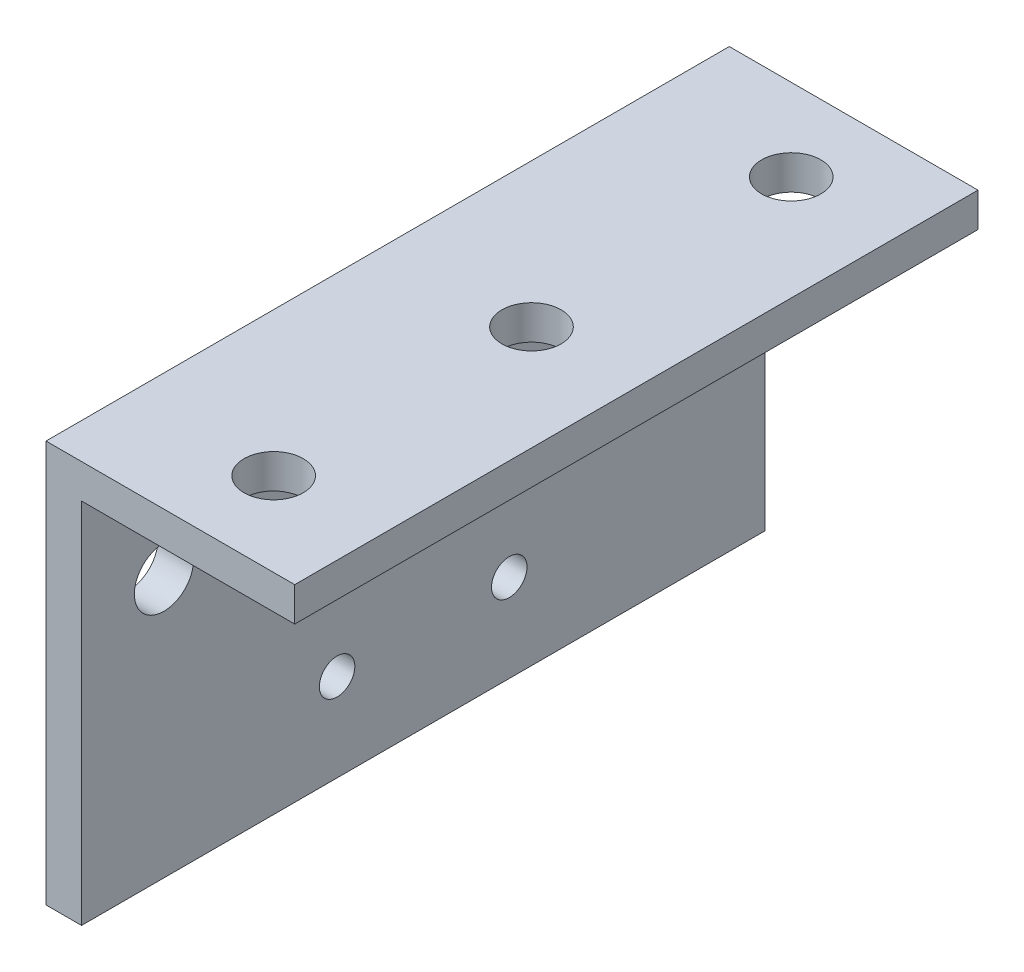
ISO-10303-21;
HEADER;
FILE_DESCRIPTION(('STEP AP214'),'2;1');
FILE_NAME('part.step','',(''),(''),'','','');
FILE_SCHEMA(('AUTOMOTIVE_DESIGN { 1 0 10303 214 1 1 1 1 }'));
ENDSEC;
DATA;
#1=APPLICATION_CONTEXT('core data for automotive mechanical design processes');
#2=APPLICATION_PROTOCOL_DEFINITION('international standard','automotive_design',2000,#1);
#3=PRODUCT_CONTEXT('',#1,'mechanical');
#4=PRODUCT('Part','Part','',(#3));
#5=PRODUCT_RELATED_PRODUCT_CATEGORY('part','',(#4));
#6=PRODUCT_DEFINITION_FORMATION('','',#4);
#7=PRODUCT_DEFINITION_CONTEXT('part definition',#1,'design');
#8=PRODUCT_DEFINITION('design','',#6,#7);
#9=PRODUCT_DEFINITION_SHAPE('','',#8);
#10=(LENGTH_UNIT() NAMED_UNIT(*) SI_UNIT(.MILLI.,.METRE.));
#11=(NAMED_UNIT(*) PLANE_ANGLE_UNIT() SI_UNIT($,.RADIAN.));
#12=(NAMED_UNIT(*) SI_UNIT($,.STERADIAN.) SOLID_ANGLE_UNIT());
#13=UNCERTAINTY_MEASURE_WITH_UNIT(LENGTH_MEASURE(1.E-05),#10,'distance_accuracy_value','');
#14=(GEOMETRIC_REPRESENTATION_CONTEXT(3) GLOBAL_UNCERTAINTY_ASSIGNED_CONTEXT((#13)) GLOBAL_UNIT_ASSIGNED_CONTEXT((#10,
#11,#12)) REPRESENTATION_CONTEXT('',''));
#15=CARTESIAN_POINT('',(0.,0.,0.));
#16=DIRECTION('',(0.,0.,1.));
#17=DIRECTION('',(1.,0.,0.));
#18=AXIS2_PLACEMENT_3D('',#15,#16,#17);
#19=CARTESIAN_POINT('',(0.,0.,63.5));
#20=DIRECTION('',(0.,1.,0.));
#21=DIRECTION('',(0.,0.,1.));
#22=AXIS2_PLACEMENT_3D('',#19,#20,#21);
#23=PLANE('',#22);
#24=DIRECTION('',(1.,0.,0.));
#25=VECTOR('',#24,1.);
#26=CARTESIAN_POINT('',(0.,0.,0.));
#27=LINE('',#26,#25);
#28=CARTESIAN_POINT('',(0.,0.,0.));
#29=VERTEX_POINT('',#28);
#30=CARTESIAN_POINT('',(3.302,0.,0.));
#31=VERTEX_POINT('',#30);
#32=EDGE_CURVE('E122',#29,#31,#27,.T.);
#33=ORIENTED_EDGE('',*,*,#32,.T.);
#34=DIRECTION('',(0.,0.,-1.));
#35=VECTOR('',#34,1.);
#36=CARTESIAN_POINT('',(3.302,0.,63.5));
#37=LINE('',#36,#35);
#38=CARTESIAN_POINT('',(3.302,0.,63.5));
#39=VERTEX_POINT('',#38);
#40=EDGE_CURVE('E11',#39,#31,#37,.T.);
#41=ORIENTED_EDGE('',*,*,#40,.F.);
#42=DIRECTION('',(1.,0.,0.));
#43=VECTOR('',#42,1.);
#44=CARTESIAN_POINT('',(0.,0.,63.5));
#45=LINE('',#44,#43);
#46=CARTESIAN_POINT('',(0.,0.,63.5));
#47=VERTEX_POINT('',#46);
#48=EDGE_CURVE('E133',#47,#39,#45,.T.);
#49=ORIENTED_EDGE('',*,*,#48,.F.);
#50=DIRECTION('',(0.,0.,-1.));
#51=VECTOR('',#50,1.);
#52=CARTESIAN_POINT('',(0.,0.,63.5));
#53=LINE('',#52,#51);
#54=EDGE_CURVE('E118',#47,#29,#53,.T.);
#55=ORIENTED_EDGE('',*,*,#54,.T.);
#56=EDGE_LOOP('',(#33,#41,#49,#55));
#57=FACE_BOUND('',#56,.T.);
#58=ADVANCED_FACE('F38',(#57),#23,.F.);
#59=CARTESIAN_POINT('',(3.302,0.,63.5));
#60=DIRECTION('',(-1.,0.,0.));
#61=DIRECTION('',(0.,0.,1.));
#62=AXIS2_PLACEMENT_3D('',#59,#60,#61);
#63=PLANE('',#62);
#64=CARTESIAN_POINT('',(3.302,24.163,23.75));
#65=DIRECTION('',(-1.,0.,0.));
#66=DIRECTION('',(0.,0.,1.));
#67=AXIS2_PLACEMENT_3D('',#64,#65,#66);
#68=CIRCLE('',#67,1.64999999999999);
#69=CARTESIAN_POINT('',(3.302,24.163,25.4));
#70=VERTEX_POINT('',#69);
#71=EDGE_CURVE('E396',#70,#70,#68,.T.);
#72=ORIENTED_EDGE('',*,*,#71,.T.);
#73=EDGE_LOOP('',(#72));
#74=FACE_BOUND('',#73,.T.);
#75=CARTESIAN_POINT('',(3.302,8.16299999999999,23.75));
#76=DIRECTION('',(-1.,0.,0.));
#77=DIRECTION('',(0.,0.,1.));
#78=AXIS2_PLACEMENT_3D('',#75,#76,#77);
#79=CIRCLE('',#78,1.64999999999999);
#80=CARTESIAN_POINT('',(3.302,8.16299999999999,25.4));
#81=VERTEX_POINT('',#80);
#82=EDGE_CURVE('E390',#81,#81,#79,.T.);
#83=ORIENTED_EDGE('',*,*,#82,.T.);
#84=EDGE_LOOP('',(#83));
#85=FACE_BOUND('',#84,.T.);
#86=CARTESIAN_POINT('',(3.302,8.163,39.75));
#87=DIRECTION('',(-1.,0.,0.));
#88=DIRECTION('',(0.,0.,1.));
#89=AXIS2_PLACEMENT_3D('',#86,#87,#88);
#90=CIRCLE('',#89,1.64999999999999);
#91=CARTESIAN_POINT('',(3.302,8.163,41.4));
#92=VERTEX_POINT('',#91);
#93=EDGE_CURVE('E384',#92,#92,#90,.T.);
#94=ORIENTED_EDGE('',*,*,#93,.T.);
#95=EDGE_LOOP('',(#94));
#96=FACE_BOUND('',#95,.T.);
#97=CARTESIAN_POINT('',(3.302,24.163,39.75));
#98=DIRECTION('',(-1.,0.,0.));
#99=DIRECTION('',(0.,0.,1.));
#100=AXIS2_PLACEMENT_3D('',#97,#98,#99);
#101=CIRCLE('',#100,1.64999999999999);
#102=CARTESIAN_POINT('',(3.302,24.163,41.4));
#103=VERTEX_POINT('',#102);
#104=EDGE_CURVE('E378',#103,#103,#101,.T.);
#105=ORIENTED_EDGE('',*,*,#104,.T.);
#106=EDGE_LOOP('',(#105));
#107=FACE_BOUND('',#106,.T.);
#108=CARTESIAN_POINT('',(3.302,24.2082215193958,7.6776384833819));
#109=DIRECTION('',(-1.,0.,0.));
#110=DIRECTION('',(0.,0.,1.));
#111=AXIS2_PLACEMENT_3D('',#108,#109,#110);
#112=CIRCLE('',#111,2.75);
#113=CARTESIAN_POINT('',(3.302,24.2082215193958,10.4276384833819));
#114=VERTEX_POINT('',#113);
#115=EDGE_CURVE('E350',#114,#114,#112,.T.);
#116=ORIENTED_EDGE('',*,*,#115,.T.);
#117=EDGE_LOOP('',(#116));
#118=FACE_BOUND('',#117,.T.);
#119=CARTESIAN_POINT('',(3.302,24.2082215193958,55.8413474799005));
#120=DIRECTION('',(-1.,0.,0.));
#121=DIRECTION('',(0.,0.,1.));
#122=AXIS2_PLACEMENT_3D('',#119,#120,#121);
#123=CIRCLE('',#122,2.75);
#124=CARTESIAN_POINT('',(3.302,24.2082215193958,58.5913474799005));
#125=VERTEX_POINT('',#124);
#126=EDGE_CURVE('E126',#125,#125,#123,.T.);
#127=ORIENTED_EDGE('',*,*,#126,.T.);
#128=EDGE_LOOP('',(#127));
#129=FACE_BOUND('',#128,.T.);
#130=DIRECTION('',(0.,1.,0.));
#131=VECTOR('',#130,1.);
#132=CARTESIAN_POINT('',(3.302,0.,0.));
#133=LINE('',#132,#131);
#134=CARTESIAN_POINT('',(3.302,34.163,0.));
#135=VERTEX_POINT('',#134);
#136=EDGE_CURVE('E125',#31,#135,#133,.T.);
#137=ORIENTED_EDGE('',*,*,#136,.T.);
#138=DIRECTION('',(0.,0.,-1.));
#139=VECTOR('',#138,1.);
#140=CARTESIAN_POINT('',(3.302,34.163,63.5));
#141=LINE('',#140,#139);
#142=CARTESIAN_POINT('',(3.302,34.163,63.5));
#143=VERTEX_POINT('',#142);
#144=EDGE_CURVE('E46',#143,#135,#141,.T.);
#145=ORIENTED_EDGE('',*,*,#144,.F.);
#146=DIRECTION('',(0.,1.,0.));
#147=VECTOR('',#146,1.);
#148=CARTESIAN_POINT('',(3.302,0.,63.5));
#149=LINE('',#148,#147);
#150=EDGE_CURVE('E91',#39,#143,#149,.T.);
#151=ORIENTED_EDGE('',*,*,#150,.F.);
#152=ORIENTED_EDGE('',*,*,#40,.T.);
#153=EDGE_LOOP('',(#137,#145,#151,#152));
#154=FACE_BOUND('',#153,.T.);
#155=ADVANCED_FACE('F161',(#74,#85,#96,#107,#118,#129,#154),#63,.F.);
#156=CARTESIAN_POINT('',(3.302,34.163,63.5));
#157=DIRECTION('',(0.,1.,0.));
#158=DIRECTION('',(0.,0.,1.));
#159=AXIS2_PLACEMENT_3D('',#156,#157,#158);
#160=PLANE('',#159);
#161=CARTESIAN_POINT('',(13.3685820866548,34.163,7.61064961564513));
#162=DIRECTION('',(0.,1.,0.));
#163=DIRECTION('',(0.,0.,1.));
#164=AXIS2_PLACEMENT_3D('',#161,#162,#163);
#165=CIRCLE('',#164,2.74999999999999);
#166=CARTESIAN_POINT('',(13.3685820866548,34.163,10.3606496156451));
#167=VERTEX_POINT('',#166);
#168=EDGE_CURVE('E372',#167,#167,#165,.T.);
#169=ORIENTED_EDGE('',*,*,#168,.T.);
#170=EDGE_LOOP('',(#169));
#171=FACE_BOUND('',#170,.T.);
#172=CARTESIAN_POINT('',(13.3685820866548,34.163,55.7136932764438));
#173=DIRECTION('',(0.,1.,0.));
#174=DIRECTION('',(0.,0.,1.));
#175=AXIS2_PLACEMENT_3D('',#172,#173,#174);
#176=CIRCLE('',#175,2.74999999999999);
#177=CARTESIAN_POINT('',(13.3685820866548,34.163,58.4636932764438));
#178=VERTEX_POINT('',#177);
#179=EDGE_CURVE('E366',#178,#178,#176,.T.);
#180=ORIENTED_EDGE('',*,*,#179,.T.);
#181=EDGE_LOOP('',(#180));
#182=FACE_BOUND('',#181,.T.);
#183=CARTESIAN_POINT('',(13.3685820866548,34.163,31.75));
#184=DIRECTION('',(0.,1.,0.));
#185=DIRECTION('',(0.,0.,1.));
#186=AXIS2_PLACEMENT_3D('',#183,#184,#185);
#187=CIRCLE('',#186,2.74999999999999);
#188=CARTESIAN_POINT('',(13.3685820866548,34.163,34.5));
#189=VERTEX_POINT('',#188);
#190=EDGE_CURVE('E360',#189,#189,#187,.T.);
#191=ORIENTED_EDGE('',*,*,#190,.T.);
#192=EDGE_LOOP('',(#191));
#193=FACE_BOUND('',#192,.T.);
#194=DIRECTION('',(1.,0.,0.));
#195=VECTOR('',#194,1.);
#196=CARTESIAN_POINT('',(3.302,34.163,0.));
#197=LINE('',#196,#195);
#198=CARTESIAN_POINT('',(23.114,34.163,0.));
#199=VERTEX_POINT('',#198);
#200=EDGE_CURVE('E128',#135,#199,#197,.T.);
#201=ORIENTED_EDGE('',*,*,#200,.T.);
#202=DIRECTION('',(0.,0.,-1.));
#203=VECTOR('',#202,1.);
#204=CARTESIAN_POINT('',(23.114,34.163,63.5));
#205=LINE('',#204,#203);
#206=CARTESIAN_POINT('',(23.114,34.163,63.5));
#207=VERTEX_POINT('',#206);
#208=EDGE_CURVE('E113',#207,#199,#205,.T.);
#209=ORIENTED_EDGE('',*,*,#208,.F.);
#210=DIRECTION('',(1.,0.,0.));
#211=VECTOR('',#210,1.);
#212=CARTESIAN_POINT('',(3.302,34.163,63.5));
#213=LINE('',#212,#211);
#214=EDGE_CURVE('E104',#143,#207,#213,.T.);
#215=ORIENTED_EDGE('',*,*,#214,.F.);
#216=ORIENTED_EDGE('',*,*,#144,.T.);
#217=EDGE_LOOP('',(#201,#209,#215,#216));
#218=FACE_BOUND('',#217,.T.);
#219=ADVANCED_FACE('F139',(#171,#182,#193,#218),#160,.F.);
#220=CARTESIAN_POINT('',(23.114,37.338,63.5));
#221=DIRECTION('',(-1.,0.,0.));
#222=DIRECTION('',(0.,-1.,0.));
#223=AXIS2_PLACEMENT_3D('',#220,#221,#222);
#224=PLANE('',#223);
#225=DIRECTION('',(0.,1.,0.));
#226=VECTOR('',#225,1.);
#227=CARTESIAN_POINT('',(23.114,37.338,0.));
#228=LINE('',#227,#226);
#229=CARTESIAN_POINT('',(23.114,37.338,0.));
#230=VERTEX_POINT('',#229);
#231=EDGE_CURVE('E112',#199,#230,#228,.T.);
#232=ORIENTED_EDGE('',*,*,#231,.T.);
#233=DIRECTION('',(0.,0.,-1.));
#234=VECTOR('',#233,1.);
#235=CARTESIAN_POINT('',(23.114,37.338,63.5));
#236=LINE('',#235,#234);
#237=CARTESIAN_POINT('',(23.114,37.338,63.5));
#238=VERTEX_POINT('',#237);
#239=EDGE_CURVE('E109',#238,#230,#236,.T.);
#240=ORIENTED_EDGE('',*,*,#239,.F.);
#241=DIRECTION('',(0.,1.,0.));
#242=VECTOR('',#241,1.);
#243=CARTESIAN_POINT('',(23.114,37.338,63.5));
#244=LINE('',#243,#242);
#245=EDGE_CURVE('E98',#207,#238,#244,.T.);
#246=ORIENTED_EDGE('',*,*,#245,.F.);
#247=ORIENTED_EDGE('',*,*,#208,.T.);
#248=EDGE_LOOP('',(#232,#240,#246,#247));
#249=FACE_BOUND('',#248,.T.);
#250=ADVANCED_FACE('F110',(#249),#224,.F.);
#251=CARTESIAN_POINT('',(0.,37.338,63.5));
#252=DIRECTION('',(0.,-1.,0.));
#253=DIRECTION('',(0.,0.,-1.));
#254=AXIS2_PLACEMENT_3D('',#251,#252,#253);
#255=PLANE('',#254);
#256=CARTESIAN_POINT('',(13.3685820866548,37.338,7.61064961564513));
#257=DIRECTION('',(0.,1.,0.));
#258=DIRECTION('',(0.,0.,1.));
#259=AXIS2_PLACEMENT_3D('',#256,#257,#258);
#260=CIRCLE('',#259,2.75);
#261=CARTESIAN_POINT('',(13.3685820866548,37.338,10.3606496156451));
#262=VERTEX_POINT('',#261);
#263=EDGE_CURVE('E375',#262,#262,#260,.T.);
#264=ORIENTED_EDGE('',*,*,#263,.F.);
#265=EDGE_LOOP('',(#264));
#266=FACE_BOUND('',#265,.T.);
#267=CARTESIAN_POINT('',(13.3685820866548,37.338,55.7136932764438));
#268=DIRECTION('',(0.,1.,0.));
#269=DIRECTION('',(0.,0.,1.));
#270=AXIS2_PLACEMENT_3D('',#267,#268,#269);
#271=CIRCLE('',#270,2.75);
#272=CARTESIAN_POINT('',(13.3685820866548,37.338,58.4636932764438));
#273=VERTEX_POINT('',#272);
#274=EDGE_CURVE('E369',#273,#273,#271,.T.);
#275=ORIENTED_EDGE('',*,*,#274,.F.);
#276=EDGE_LOOP('',(#275));
#277=FACE_BOUND('',#276,.T.);
#278=CARTESIAN_POINT('',(13.3685820866548,37.338,31.75));
#279=DIRECTION('',(0.,1.,0.));
#280=DIRECTION('',(0.,0.,1.));
#281=AXIS2_PLACEMENT_3D('',#278,#279,#280);
#282=CIRCLE('',#281,2.75);
#283=CARTESIAN_POINT('',(13.3685820866548,37.338,34.5));
#284=VERTEX_POINT('',#283);
#285=EDGE_CURVE('E363',#284,#284,#282,.T.);
#286=ORIENTED_EDGE('',*,*,#285,.F.);
#287=EDGE_LOOP('',(#286));
#288=FACE_BOUND('',#287,.T.);
#289=DIRECTION('',(-1.,0.,0.));
#290=VECTOR('',#289,1.);
#291=CARTESIAN_POINT('',(0.,37.338,0.));
#292=LINE('',#291,#290);
#293=CARTESIAN_POINT('',(0.,37.338,0.));
#294=VERTEX_POINT('',#293);
#295=EDGE_CURVE('E77',#230,#294,#292,.T.);
#296=ORIENTED_EDGE('',*,*,#295,.T.);
#297=DIRECTION('',(0.,0.,-1.));
#298=VECTOR('',#297,1.);
#299=CARTESIAN_POINT('',(0.,37.338,63.5));
#300=LINE('',#299,#298);
#301=CARTESIAN_POINT('',(0.,37.338,63.5));
#302=VERTEX_POINT('',#301);
#303=EDGE_CURVE('E114',#302,#294,#300,.T.);
#304=ORIENTED_EDGE('',*,*,#303,.F.);
#305=DIRECTION('',(-1.,0.,0.));
#306=VECTOR('',#305,1.);
#307=CARTESIAN_POINT('',(0.,37.338,63.5));
#308=LINE('',#307,#306);
#309=EDGE_CURVE('E102',#238,#302,#308,.T.);
#310=ORIENTED_EDGE('',*,*,#309,.F.);
#311=ORIENTED_EDGE('',*,*,#239,.T.);
#312=EDGE_LOOP('',(#296,#304,#310,#311));
#313=FACE_BOUND('',#312,.T.);
#314=ADVANCED_FACE('F116',(#266,#277,#288,#313),#255,.F.);
#315=CARTESIAN_POINT('',(0.,0.,63.5));
#316=DIRECTION('',(1.,0.,0.));
#317=DIRECTION('',(0.,0.,-1.));
#318=AXIS2_PLACEMENT_3D('',#315,#316,#317);
#319=PLANE('',#318);
#320=CARTESIAN_POINT('',(0.,24.163,23.75));
#321=DIRECTION('',(-1.,0.,0.));
#322=DIRECTION('',(0.,0.,1.));
#323=AXIS2_PLACEMENT_3D('',#320,#321,#322);
#324=CIRCLE('',#323,1.64999999999999);
#325=CARTESIAN_POINT('',(0.,24.163,25.4));
#326=VERTEX_POINT('',#325);
#327=EDGE_CURVE('E398',#326,#326,#324,.T.);
#328=ORIENTED_EDGE('',*,*,#327,.F.);
#329=EDGE_LOOP('',(#328));
#330=FACE_BOUND('',#329,.T.);
#331=CARTESIAN_POINT('',(0.,8.16299999999999,23.75));
#332=DIRECTION('',(-1.,0.,0.));
#333=DIRECTION('',(0.,0.,1.));
#334=AXIS2_PLACEMENT_3D('',#331,#332,#333);
#335=CIRCLE('',#334,1.64999999999999);
#336=CARTESIAN_POINT('',(0.,8.16299999999999,25.4));
#337=VERTEX_POINT('',#336);
#338=EDGE_CURVE('E393',#337,#337,#335,.T.);
#339=ORIENTED_EDGE('',*,*,#338,.F.);
#340=EDGE_LOOP('',(#339));
#341=FACE_BOUND('',#340,.T.);
#342=CARTESIAN_POINT('',(0.,8.163,39.75));
#343=DIRECTION('',(-1.,0.,0.));
#344=DIRECTION('',(0.,0.,1.));
#345=AXIS2_PLACEMENT_3D('',#342,#343,#344);
#346=CIRCLE('',#345,1.64999999999999);
#347=CARTESIAN_POINT('',(0.,8.163,41.4));
#348=VERTEX_POINT('',#347);
#349=EDGE_CURVE('E387',#348,#348,#346,.T.);
#350=ORIENTED_EDGE('',*,*,#349,.F.);
#351=EDGE_LOOP('',(#350));
#352=FACE_BOUND('',#351,.T.);
#353=CARTESIAN_POINT('',(0.,24.163,39.75));
#354=DIRECTION('',(-1.,0.,0.));
#355=DIRECTION('',(0.,0.,1.));
#356=AXIS2_PLACEMENT_3D('',#353,#354,#355);
#357=CIRCLE('',#356,1.64999999999999);
#358=CARTESIAN_POINT('',(0.,24.163,41.4));
#359=VERTEX_POINT('',#358);
#360=EDGE_CURVE('E381',#359,#359,#357,.T.);
#361=ORIENTED_EDGE('',*,*,#360,.F.);
#362=EDGE_LOOP('',(#361));
#363=FACE_BOUND('',#362,.T.);
#364=CARTESIAN_POINT('',(0.,24.2082215193958,7.6776384833819));
#365=DIRECTION('',(-1.,0.,0.));
#366=DIRECTION('',(0.,0.,1.));
#367=AXIS2_PLACEMENT_3D('',#364,#365,#366);
#368=CIRCLE('',#367,2.75);
#369=CARTESIAN_POINT('',(0.,24.2082215193958,10.4276384833819));
#370=VERTEX_POINT('',#369);
#371=EDGE_CURVE('E357',#370,#370,#368,.T.);
#372=ORIENTED_EDGE('',*,*,#371,.F.);
#373=EDGE_LOOP('',(#372));
#374=FACE_BOUND('',#373,.T.);
#375=CARTESIAN_POINT('',(0.,24.2082215193958,55.8413474799005));
#376=DIRECTION('',(-1.,0.,0.));
#377=DIRECTION('',(0.,0.,1.));
#378=AXIS2_PLACEMENT_3D('',#375,#376,#377);
#379=CIRCLE('',#378,2.75);
#380=CARTESIAN_POINT('',(0.,24.2082215193958,58.5913474799005));
#381=VERTEX_POINT('',#380);
#382=EDGE_CURVE('E345',#381,#381,#379,.T.);
#383=ORIENTED_EDGE('',*,*,#382,.F.);
#384=EDGE_LOOP('',(#383));
#385=FACE_BOUND('',#384,.T.);
#386=DIRECTION('',(0.,-1.,0.));
#387=VECTOR('',#386,1.);
#388=CARTESIAN_POINT('',(0.,0.,0.));
#389=LINE('',#388,#387);
#390=EDGE_CURVE('E83',#294,#29,#389,.T.);
#391=ORIENTED_EDGE('',*,*,#390,.T.);
#392=ORIENTED_EDGE('',*,*,#54,.F.);
#393=DIRECTION('',(0.,-1.,0.));
#394=VECTOR('',#393,1.);
#395=CARTESIAN_POINT('',(0.,0.,63.5));
#396=LINE('',#395,#394);
#397=EDGE_CURVE('E54',#302,#47,#396,.T.);
#398=ORIENTED_EDGE('',*,*,#397,.F.);
#399=ORIENTED_EDGE('',*,*,#303,.T.);
#400=EDGE_LOOP('',(#391,#392,#398,#399));
#401=FACE_BOUND('',#400,.T.);
#402=ADVANCED_FACE('F146',(#330,#341,#352,#363,#374,#385,#401),#319,.F.);
#403=CARTESIAN_POINT('',(0.,0.,63.5));
#404=DIRECTION('',(0.,0.,1.));
#405=DIRECTION('',(1.,0.,0.));
#406=AXIS2_PLACEMENT_3D('',#403,#404,#405);
#407=PLANE('',#406);
#408=ORIENTED_EDGE('',*,*,#48,.T.);
#409=ORIENTED_EDGE('',*,*,#150,.T.);
#410=ORIENTED_EDGE('',*,*,#214,.T.);
#411=ORIENTED_EDGE('',*,*,#245,.T.);
#412=ORIENTED_EDGE('',*,*,#309,.T.);
#413=ORIENTED_EDGE('',*,*,#397,.T.);
#414=EDGE_LOOP('',(#408,#409,#410,#411,#412,#413));
#415=FACE_BOUND('',#414,.T.);
#416=ADVANCED_FACE('F100',(#415),#407,.T.);
#417=CARTESIAN_POINT('',(0.,0.,0.));
#418=DIRECTION('',(0.,0.,1.));
#419=DIRECTION('',(1.,0.,0.));
#420=AXIS2_PLACEMENT_3D('',#417,#418,#419);
#421=PLANE('',#420);
#422=ORIENTED_EDGE('',*,*,#32,.F.);
#423=ORIENTED_EDGE('',*,*,#390,.F.);
#424=ORIENTED_EDGE('',*,*,#295,.F.);
#425=ORIENTED_EDGE('',*,*,#231,.F.);
#426=ORIENTED_EDGE('',*,*,#200,.F.);
#427=ORIENTED_EDGE('',*,*,#136,.F.);
#428=EDGE_LOOP('',(#422,#423,#424,#425,#426,#427));
#429=FACE_BOUND('',#428,.T.);
#430=ADVANCED_FACE('F142',(#429),#421,.F.);
#431=CARTESIAN_POINT('',(0.,24.2082215193958,55.8413474799005));
#432=DIRECTION('',(-1.,0.,0.));
#433=DIRECTION('',(0.,0.,1.));
#434=AXIS2_PLACEMENT_3D('',#431,#432,#433);
#435=CYLINDRICAL_SURFACE('',#434,2.75);
#436=ORIENTED_EDGE('',*,*,#382,.T.);
#437=EDGE_LOOP('',(#436));
#438=FACE_BOUND('',#437,.T.);
#439=ORIENTED_EDGE('',*,*,#126,.F.);
#440=EDGE_LOOP('',(#439));
#441=FACE_BOUND('',#440,.T.);
#442=ADVANCED_FACE('F289',(#438,#441),#435,.F.);
#443=CARTESIAN_POINT('',(0.,24.2082215193958,7.6776384833819));
#444=DIRECTION('',(-1.,0.,0.));
#445=DIRECTION('',(0.,0.,1.));
#446=AXIS2_PLACEMENT_3D('',#443,#444,#445);
#447=CYLINDRICAL_SURFACE('',#446,2.75);
#448=ORIENTED_EDGE('',*,*,#371,.T.);
#449=EDGE_LOOP('',(#448));
#450=FACE_BOUND('',#449,.T.);
#451=ORIENTED_EDGE('',*,*,#115,.F.);
#452=EDGE_LOOP('',(#451));
#453=FACE_BOUND('',#452,.T.);
#454=ADVANCED_FACE('F279',(#450,#453),#447,.F.);
#455=CARTESIAN_POINT('',(13.3685820866548,37.338,31.75));
#456=DIRECTION('',(0.,1.,0.));
#457=DIRECTION('',(0.,0.,1.));
#458=AXIS2_PLACEMENT_3D('',#455,#456,#457);
#459=CYLINDRICAL_SURFACE('',#458,2.74999999999999);
#460=ORIENTED_EDGE('',*,*,#285,.T.);
#461=EDGE_LOOP('',(#460));
#462=FACE_BOUND('',#461,.T.);
#463=ORIENTED_EDGE('',*,*,#190,.F.);
#464=EDGE_LOOP('',(#463));
#465=FACE_BOUND('',#464,.T.);
#466=ADVANCED_FACE('F270',(#462,#465),#459,.F.);
#467=CARTESIAN_POINT('',(13.3685820866548,37.338,55.7136932764438));
#468=DIRECTION('',(0.,1.,0.));
#469=DIRECTION('',(0.,0.,1.));
#470=AXIS2_PLACEMENT_3D('',#467,#468,#469);
#471=CYLINDRICAL_SURFACE('',#470,2.74999999999999);
#472=ORIENTED_EDGE('',*,*,#274,.T.);
#473=EDGE_LOOP('',(#472));
#474=FACE_BOUND('',#473,.T.);
#475=ORIENTED_EDGE('',*,*,#179,.F.);
#476=EDGE_LOOP('',(#475));
#477=FACE_BOUND('',#476,.T.);
#478=ADVANCED_FACE('F199',(#474,#477),#471,.F.);
#479=CARTESIAN_POINT('',(13.3685820866548,37.338,7.61064961564513));
#480=DIRECTION('',(0.,1.,0.));
#481=DIRECTION('',(0.,0.,1.));
#482=AXIS2_PLACEMENT_3D('',#479,#480,#481);
#483=CYLINDRICAL_SURFACE('',#482,2.74999999999999);
#484=ORIENTED_EDGE('',*,*,#263,.T.);
#485=EDGE_LOOP('',(#484));
#486=FACE_BOUND('',#485,.T.);
#487=ORIENTED_EDGE('',*,*,#168,.F.);
#488=EDGE_LOOP('',(#487));
#489=FACE_BOUND('',#488,.T.);
#490=ADVANCED_FACE('F194',(#486,#489),#483,.F.);
#491=CARTESIAN_POINT('',(0.,24.163,39.75));
#492=DIRECTION('',(-1.,0.,0.));
#493=DIRECTION('',(0.,0.,1.));
#494=AXIS2_PLACEMENT_3D('',#491,#492,#493);
#495=CYLINDRICAL_SURFACE('',#494,1.64999999999999);
#496=ORIENTED_EDGE('',*,*,#360,.T.);
#497=EDGE_LOOP('',(#496));
#498=FACE_BOUND('',#497,.T.);
#499=ORIENTED_EDGE('',*,*,#104,.F.);
#500=EDGE_LOOP('',(#499));
#501=FACE_BOUND('',#500,.T.);
#502=ADVANCED_FACE('F198',(#498,#501),#495,.F.);
#503=CARTESIAN_POINT('',(0.,8.163,39.75));
#504=DIRECTION('',(-1.,0.,0.));
#505=DIRECTION('',(0.,0.,1.));
#506=AXIS2_PLACEMENT_3D('',#503,#504,#505);
#507=CYLINDRICAL_SURFACE('',#506,1.64999999999999);
#508=ORIENTED_EDGE('',*,*,#349,.T.);
#509=EDGE_LOOP('',(#508));
#510=FACE_BOUND('',#509,.T.);
#511=ORIENTED_EDGE('',*,*,#93,.F.);
#512=EDGE_LOOP('',(#511));
#513=FACE_BOUND('',#512,.T.);
#514=ADVANCED_FACE('F224',(#510,#513),#507,.F.);
#515=CARTESIAN_POINT('',(0.,8.16299999999999,23.75));
#516=DIRECTION('',(-1.,0.,0.));
#517=DIRECTION('',(0.,0.,1.));
#518=AXIS2_PLACEMENT_3D('',#515,#516,#517);
#519=CYLINDRICAL_SURFACE('',#518,1.64999999999999);
#520=ORIENTED_EDGE('',*,*,#338,.T.);
#521=EDGE_LOOP('',(#520));
#522=FACE_BOUND('',#521,.T.);
#523=ORIENTED_EDGE('',*,*,#82,.F.);
#524=EDGE_LOOP('',(#523));
#525=FACE_BOUND('',#524,.T.);
#526=ADVANCED_FACE('F235',(#522,#525),#519,.F.);
#527=CARTESIAN_POINT('',(0.,24.163,23.75));
#528=DIRECTION('',(-1.,0.,0.));
#529=DIRECTION('',(0.,0.,1.));
#530=AXIS2_PLACEMENT_3D('',#527,#528,#529);
#531=CYLINDRICAL_SURFACE('',#530,1.64999999999999);
#532=ORIENTED_EDGE('',*,*,#327,.T.);
#533=EDGE_LOOP('',(#532));
#534=FACE_BOUND('',#533,.T.);
#535=ORIENTED_EDGE('',*,*,#71,.F.);
#536=EDGE_LOOP('',(#535));
#537=FACE_BOUND('',#536,.T.);
#538=ADVANCED_FACE('F246',(#534,#537),#531,.F.);
#539=CLOSED_SHELL('',(#58,#155,#219,#250,#314,#402,#416,#430,#442,#454,#466,#478,#490,#502,#514,
#526,#538));
#540=MANIFOLD_SOLID_BREP('B2',#539);
#541=ADVANCED_BREP_SHAPE_REPRESENTATION('',(#18,#540),#14);
#542=SHAPE_DEFINITION_REPRESENTATION(#9,#541);
ENDSEC;
END-ISO-10303-21;
